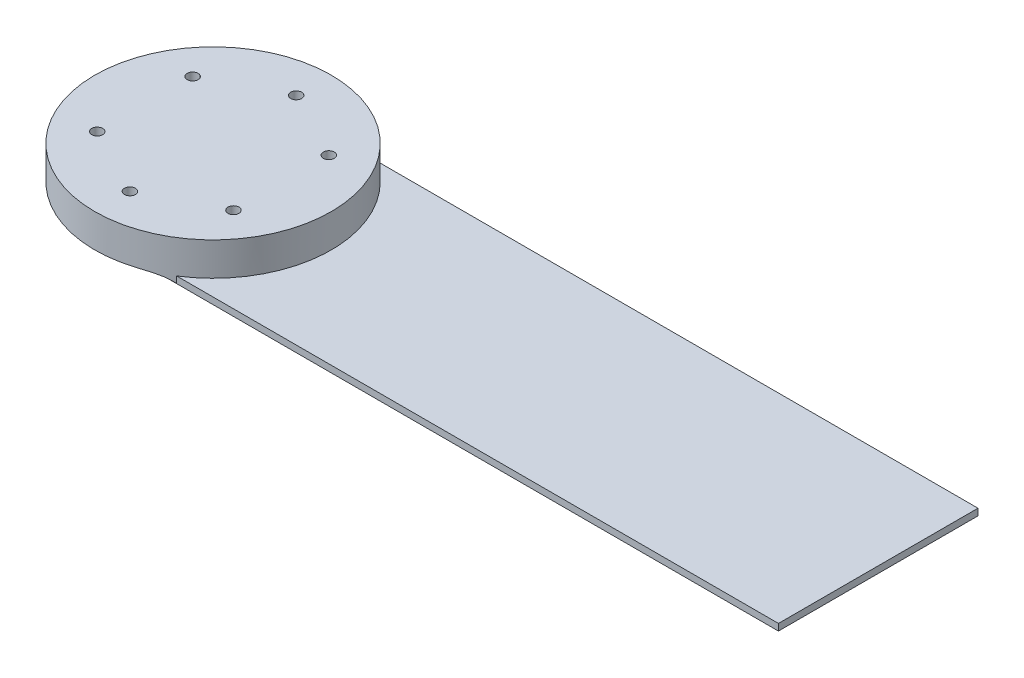
ISO-10303-21;
HEADER;
FILE_DESCRIPTION(('STEP AP214'),'2;1');
FILE_NAME('part.step','',(''),(''),'','','');
FILE_SCHEMA(('AUTOMOTIVE_DESIGN { 1 0 10303 214 1 1 1 1 }'));
ENDSEC;
DATA;
#1=APPLICATION_CONTEXT('core data for automotive mechanical design processes');
#2=APPLICATION_PROTOCOL_DEFINITION('international standard','automotive_design',2000,#1);
#3=PRODUCT_CONTEXT('',#1,'mechanical');
#4=PRODUCT('Part','Part','',(#3));
#5=PRODUCT_RELATED_PRODUCT_CATEGORY('part','',(#4));
#6=PRODUCT_DEFINITION_FORMATION('','',#4);
#7=PRODUCT_DEFINITION_CONTEXT('part definition',#1,'design');
#8=PRODUCT_DEFINITION('design','',#6,#7);
#9=PRODUCT_DEFINITION_SHAPE('','',#8);
#10=(LENGTH_UNIT() NAMED_UNIT(*) SI_UNIT(.MILLI.,.METRE.));
#11=(NAMED_UNIT(*) PLANE_ANGLE_UNIT() SI_UNIT($,.RADIAN.));
#12=(NAMED_UNIT(*) SI_UNIT($,.STERADIAN.) SOLID_ANGLE_UNIT());
#13=UNCERTAINTY_MEASURE_WITH_UNIT(LENGTH_MEASURE(1.E-05),#10,'distance_accuracy_value','');
#14=(GEOMETRIC_REPRESENTATION_CONTEXT(3) GLOBAL_UNCERTAINTY_ASSIGNED_CONTEXT((#13)) GLOBAL_UNIT_ASSIGNED_CONTEXT((#10,
#11,#12)) REPRESENTATION_CONTEXT('',''));
#15=CARTESIAN_POINT('',(0.,0.,0.));
#16=DIRECTION('',(0.,0.,1.));
#17=DIRECTION('',(1.,0.,0.));
#18=AXIS2_PLACEMENT_3D('',#15,#16,#17);
#19=CARTESIAN_POINT('',(0.,2.,60.));
#20=DIRECTION('',(0.,0.,-1.));
#21=DIRECTION('',(-1.,0.,0.));
#22=AXIS2_PLACEMENT_3D('',#19,#20,#21);
#23=PLANE('',#22);
#24=DIRECTION('',(1.,0.,0.));
#25=VECTOR('',#24,1.);
#26=CARTESIAN_POINT('',(0.,2.,60.));
#27=LINE('',#26,#25);
#28=CARTESIAN_POINT('',(19.0736074196781,2.,60.));
#29=VERTEX_POINT('',#28);
#30=CARTESIAN_POINT('',(200.,2.,60.));
#31=VERTEX_POINT('',#30);
#32=EDGE_CURVE('E122',#29,#31,#27,.T.);
#33=ORIENTED_EDGE('',*,*,#32,.F.);
#34=DIRECTION('',(0.,-1.,0.));
#35=VECTOR('',#34,1.);
#36=CARTESIAN_POINT('',(19.0736074196781,2.,60.));
#37=LINE('',#36,#35);
#38=CARTESIAN_POINT('',(19.0736074196781,0.,60.));
#39=VERTEX_POINT('',#38);
#40=EDGE_CURVE('E50',#29,#39,#37,.T.);
#41=ORIENTED_EDGE('',*,*,#40,.T.);
#42=DIRECTION('',(1.,0.,0.));
#43=VECTOR('',#42,1.);
#44=CARTESIAN_POINT('',(0.,0.,60.));
#45=LINE('',#44,#43);
#46=CARTESIAN_POINT('',(200.,0.,60.));
#47=VERTEX_POINT('',#46);
#48=EDGE_CURVE('E127',#39,#47,#45,.T.);
#49=ORIENTED_EDGE('',*,*,#48,.T.);
#50=DIRECTION('',(0.,-1.,0.));
#51=VECTOR('',#50,1.);
#52=CARTESIAN_POINT('',(200.,2.,60.));
#53=LINE('',#52,#51);
#54=EDGE_CURVE('E136',#31,#47,#53,.T.);
#55=ORIENTED_EDGE('',*,*,#54,.F.);
#56=EDGE_LOOP('',(#33,#41,#49,#55));
#57=FACE_BOUND('',#56,.T.);
#58=ADVANCED_FACE('F33',(#57),#23,.F.);
#59=CARTESIAN_POINT('',(200.,2.,60.));
#60=DIRECTION('',(-1.,0.,0.));
#61=DIRECTION('',(0.,0.,1.));
#62=AXIS2_PLACEMENT_3D('',#59,#60,#61);
#63=PLANE('',#62);
#64=DIRECTION('',(0.,0.,-1.));
#65=VECTOR('',#64,1.);
#66=CARTESIAN_POINT('',(200.,0.,60.));
#67=LINE('',#66,#65);
#68=CARTESIAN_POINT('',(200.,0.,0.));
#69=VERTEX_POINT('',#68);
#70=EDGE_CURVE('E131',#47,#69,#67,.T.);
#71=ORIENTED_EDGE('',*,*,#70,.T.);
#72=DIRECTION('',(0.,-1.,0.));
#73=VECTOR('',#72,1.);
#74=CARTESIAN_POINT('',(200.,2.,0.));
#75=LINE('',#74,#73);
#76=CARTESIAN_POINT('',(200.,2.,0.));
#77=VERTEX_POINT('',#76);
#78=EDGE_CURVE('E111',#77,#69,#75,.T.);
#79=ORIENTED_EDGE('',*,*,#78,.F.);
#80=DIRECTION('',(0.,0.,-1.));
#81=VECTOR('',#80,1.);
#82=CARTESIAN_POINT('',(200.,2.,60.));
#83=LINE('',#82,#81);
#84=EDGE_CURVE('E109',#31,#77,#83,.T.);
#85=ORIENTED_EDGE('',*,*,#84,.F.);
#86=ORIENTED_EDGE('',*,*,#54,.T.);
#87=EDGE_LOOP('',(#71,#79,#85,#86));
#88=FACE_BOUND('',#87,.T.);
#89=ADVANCED_FACE('F174',(#88),#63,.F.);
#90=CARTESIAN_POINT('',(0.,2.,0.));
#91=DIRECTION('',(0.,0.,1.));
#92=DIRECTION('',(1.,0.,0.));
#93=AXIS2_PLACEMENT_3D('',#90,#91,#92);
#94=PLANE('',#93);
#95=DIRECTION('',(-1.,0.,0.));
#96=VECTOR('',#95,1.);
#97=CARTESIAN_POINT('',(0.,0.,0.));
#98=LINE('',#97,#96);
#99=CARTESIAN_POINT('',(19.0736074196781,0.,0.));
#100=VERTEX_POINT('',#99);
#101=EDGE_CURVE('E99',#69,#100,#98,.T.);
#102=ORIENTED_EDGE('',*,*,#101,.T.);
#103=DIRECTION('',(0.,-1.,0.));
#104=VECTOR('',#103,1.);
#105=CARTESIAN_POINT('',(19.0736074196781,0.,0.));
#106=LINE('',#105,#104);
#107=CARTESIAN_POINT('',(19.0736074196781,2.,0.));
#108=VERTEX_POINT('',#107);
#109=EDGE_CURVE('E93',#100,#108,#106,.F.);
#110=ORIENTED_EDGE('',*,*,#109,.T.);
#111=DIRECTION('',(-1.,0.,0.));
#112=VECTOR('',#111,1.);
#113=CARTESIAN_POINT('',(0.,2.,0.));
#114=LINE('',#113,#112);
#115=EDGE_CURVE('E97',#77,#108,#114,.T.);
#116=ORIENTED_EDGE('',*,*,#115,.F.);
#117=ORIENTED_EDGE('',*,*,#78,.T.);
#118=EDGE_LOOP('',(#102,#110,#116,#117));
#119=FACE_BOUND('',#118,.T.);
#120=ADVANCED_FACE('F95',(#119),#94,.F.);
#121=CARTESIAN_POINT('',(0.,2.,30.));
#122=DIRECTION('',(0.,1.,0.));
#123=DIRECTION('',(0.,0.,1.));
#124=AXIS2_PLACEMENT_3D('',#121,#122,#123);
#125=PLANE('',#124);
#126=CARTESIAN_POINT('',(0.,2.,30.));
#127=DIRECTION('',(0.,1.,0.));
#128=DIRECTION('',(0.,0.,1.));
#129=AXIS2_PLACEMENT_3D('',#126,#127,#128);
#130=CIRCLE('',#129,35.55);
#131=EDGE_CURVE('E107',#29,#108,#130,.T.);
#132=ORIENTED_EDGE('',*,*,#131,.F.);
#133=ORIENTED_EDGE('',*,*,#32,.T.);
#134=ORIENTED_EDGE('',*,*,#84,.T.);
#135=ORIENTED_EDGE('',*,*,#115,.T.);
#136=EDGE_LOOP('',(#132,#133,#134,#135));
#137=FACE_BOUND('',#136,.T.);
#138=ADVANCED_FACE('F106',(#137),#125,.T.);
#139=CARTESIAN_POINT('',(0.,0.,30.));
#140=DIRECTION('',(0.,1.,0.));
#141=DIRECTION('',(0.,0.,1.));
#142=AXIS2_PLACEMENT_3D('',#139,#140,#141);
#143=PLANE('',#142);
#144=CARTESIAN_POINT('',(0.,0.,5.));
#145=DIRECTION('',(0.,1.,0.));
#146=DIRECTION('',(0.,0.,1.));
#147=AXIS2_PLACEMENT_3D('',#144,#145,#146);
#148=CIRCLE('',#147,1.65);
#149=CARTESIAN_POINT('',(0.,0.,6.65));
#150=VERTEX_POINT('',#149);
#151=EDGE_CURVE('E190',#150,#150,#148,.T.);
#152=ORIENTED_EDGE('',*,*,#151,.T.);
#153=EDGE_LOOP('',(#152));
#154=FACE_BOUND('',#153,.T.);
#155=CARTESIAN_POINT('',(20.4788011072248,0.,44.3394109087762));
#156=DIRECTION('',(0.,1.,0.));
#157=DIRECTION('',(0.,0.,1.));
#158=AXIS2_PLACEMENT_3D('',#155,#156,#157);
#159=CIRCLE('',#158,1.65);
#160=CARTESIAN_POINT('',(20.4788011072248,0.,45.9894109087762));
#161=VERTEX_POINT('',#160);
#162=EDGE_CURVE('E192',#161,#161,#159,.T.);
#163=ORIENTED_EDGE('',*,*,#162,.T.);
#164=EDGE_LOOP('',(#163));
#165=FACE_BOUND('',#164,.T.);
#166=CARTESIAN_POINT('',(0.,0.,55.));
#167=DIRECTION('',(0.,1.,0.));
#168=DIRECTION('',(0.,0.,1.));
#169=AXIS2_PLACEMENT_3D('',#166,#167,#168);
#170=CIRCLE('',#169,1.65);
#171=CARTESIAN_POINT('',(0.,0.,56.65));
#172=VERTEX_POINT('',#171);
#173=EDGE_CURVE('E196',#172,#172,#170,.T.);
#174=ORIENTED_EDGE('',*,*,#173,.T.);
#175=EDGE_LOOP('',(#174));
#176=FACE_BOUND('',#175,.T.);
#177=CARTESIAN_POINT('',(-20.4788011072248,0.,15.6605890912238));
#178=DIRECTION('',(0.,1.,0.));
#179=DIRECTION('',(0.,0.,1.));
#180=AXIS2_PLACEMENT_3D('',#177,#178,#179);
#181=CIRCLE('',#180,1.65);
#182=CARTESIAN_POINT('',(-20.4788011072248,0.,17.3105890912238));
#183=VERTEX_POINT('',#182);
#184=EDGE_CURVE('E201',#183,#183,#181,.T.);
#185=ORIENTED_EDGE('',*,*,#184,.T.);
#186=EDGE_LOOP('',(#185));
#187=FACE_BOUND('',#186,.T.);
#188=CARTESIAN_POINT('',(-20.4788011072248,0.,44.3394109087762));
#189=DIRECTION('',(0.,1.,0.));
#190=DIRECTION('',(0.,0.,1.));
#191=AXIS2_PLACEMENT_3D('',#188,#189,#190);
#192=CIRCLE('',#191,1.65);
#193=CARTESIAN_POINT('',(-20.4788011072248,0.,45.9894109087762));
#194=VERTEX_POINT('',#193);
#195=EDGE_CURVE('E204',#194,#194,#192,.T.);
#196=ORIENTED_EDGE('',*,*,#195,.T.);
#197=EDGE_LOOP('',(#196));
#198=FACE_BOUND('',#197,.T.);
#199=CARTESIAN_POINT('',(20.4788011072248,0.,15.6605890912238));
#200=DIRECTION('',(0.,1.,0.));
#201=DIRECTION('',(0.,0.,1.));
#202=AXIS2_PLACEMENT_3D('',#199,#200,#201);
#203=CIRCLE('',#202,1.65);
#204=CARTESIAN_POINT('',(20.4788011072248,0.,17.3105890912238));
#205=VERTEX_POINT('',#204);
#206=EDGE_CURVE('E207',#205,#205,#203,.T.);
#207=ORIENTED_EDGE('',*,*,#206,.T.);
#208=EDGE_LOOP('',(#207));
#209=FACE_BOUND('',#208,.T.);
#210=CARTESIAN_POINT('',(0.,0.,30.));
#211=DIRECTION('',(0.,1.,0.));
#212=DIRECTION('',(0.,0.,1.));
#213=AXIS2_PLACEMENT_3D('',#210,#211,#212);
#214=CIRCLE('',#213,30.);
#215=CARTESIAN_POINT('',(0.,0.,0.));
#216=VERTEX_POINT('',#215);
#217=CARTESIAN_POINT('',(0.,0.,60.));
#218=VERTEX_POINT('',#217);
#219=EDGE_CURVE('E118',#216,#218,#214,.T.);
#220=ORIENTED_EDGE('',*,*,#219,.F.);
#221=EDGE_CURVE('E133',#100,#216,#98,.T.);
#222=ORIENTED_EDGE('',*,*,#221,.F.);
#223=ORIENTED_EDGE('',*,*,#101,.F.);
#224=ORIENTED_EDGE('',*,*,#70,.F.);
#225=ORIENTED_EDGE('',*,*,#48,.F.);
#226=EDGE_CURVE('E128',#218,#39,#45,.T.);
#227=ORIENTED_EDGE('',*,*,#226,.F.);
#228=EDGE_LOOP('',(#220,#222,#223,#224,#225,#227));
#229=FACE_BOUND('',#228,.T.);
#230=ADVANCED_FACE('F184',(#154,#165,#176,#187,#198,#209,#229),#143,.F.);
#231=CARTESIAN_POINT('',(0.,2.,30.));
#232=DIRECTION('',(0.,1.,0.));
#233=DIRECTION('',(0.,0.,1.));
#234=AXIS2_PLACEMENT_3D('',#231,#232,#233);
#235=PLANE('',#234);
#236=CARTESIAN_POINT('',(10.3827982740685,2.,-4.));
#237=VERTEX_POINT('',#236);
#238=CARTESIAN_POINT('',(10.3827982740685,2.,64.));
#239=VERTEX_POINT('',#238);
#240=EDGE_CURVE('E115',#237,#239,#130,.T.);
#241=ORIENTED_EDGE('',*,*,#240,.F.);
#242=DIRECTION('',(-1.,0.,0.));
#243=VECTOR('',#242,1.);
#244=CARTESIAN_POINT('',(0.,2.,-4.));
#245=LINE('',#244,#243);
#246=CARTESIAN_POINT('',(0.,2.,-4.));
#247=VERTEX_POINT('',#246);
#248=EDGE_CURVE('E102',#237,#247,#245,.T.);
#249=ORIENTED_EDGE('',*,*,#248,.T.);
#250=CARTESIAN_POINT('',(0.,2.,30.));
#251=DIRECTION('',(0.,1.,0.));
#252=DIRECTION('',(0.,0.,1.));
#253=AXIS2_PLACEMENT_3D('',#250,#251,#252);
#254=CIRCLE('',#253,34.);
#255=CARTESIAN_POINT('',(0.,2.,64.));
#256=VERTEX_POINT('',#255);
#257=EDGE_CURVE('E139',#247,#256,#254,.T.);
#258=ORIENTED_EDGE('',*,*,#257,.T.);
#259=DIRECTION('',(1.,0.,0.));
#260=VECTOR('',#259,1.);
#261=CARTESIAN_POINT('',(0.,2.,64.));
#262=LINE('',#261,#260);
#263=EDGE_CURVE('E141',#256,#239,#262,.T.);
#264=ORIENTED_EDGE('',*,*,#263,.T.);
#265=EDGE_LOOP('',(#241,#249,#258,#264));
#266=FACE_BOUND('',#265,.T.);
#267=ADVANCED_FACE('F248',(#266),#235,.F.);
#268=CARTESIAN_POINT('',(0.,12.,30.));
#269=DIRECTION('',(0.,-1.,0.));
#270=DIRECTION('',(0.,0.,-1.));
#271=AXIS2_PLACEMENT_3D('',#268,#269,#270);
#272=CYLINDRICAL_SURFACE('',#271,35.55);
#273=CARTESIAN_POINT('',(0.,12.,30.));
#274=DIRECTION('',(0.,1.,0.));
#275=DIRECTION('',(0.,0.,1.));
#276=AXIS2_PLACEMENT_3D('',#273,#274,#275);
#277=CIRCLE('',#276,35.55);
#278=CARTESIAN_POINT('',(0.,12.,65.55));
#279=VERTEX_POINT('',#278);
#280=EDGE_CURVE('E114',#279,#279,#277,.T.);
#281=ORIENTED_EDGE('',*,*,#280,.F.);
#282=EDGE_LOOP('',(#281));
#283=FACE_BOUND('',#282,.T.);
#284=ORIENTED_EDGE('',*,*,#131,.T.);
#285=ORIENTED_EDGE('',*,*,#109,.F.);
#286=CARTESIAN_POINT('',(19.0736074196781,0.,0.));
#287=CARTESIAN_POINT('',(19.0002476258057,0.062181219380142,-0.0466428067696989));
#288=CARTESIAN_POINT('',(18.925394072325,0.122118796666871,-0.0938540804961025));
#289=CARTESIAN_POINT('',(18.7730400563711,0.237728041088066,-0.189129125904289));
#290=CARTESIAN_POINT('',(18.6955406949357,0.293401452187035,-0.237192539065301));
#291=CARTESIAN_POINT('',(18.4598746727655,0.454169860802624,-0.382057772357121));
#292=CARTESIAN_POINT('',(18.2981803087823,0.553312963265395,-0.479763978893166));
#293=CARTESIAN_POINT('',(17.9693036502404,0.736398048033862,-0.674791132467497));
#294=CARTESIAN_POINT('',(17.8022031594781,0.820497926201049,-0.772104127051071));
#295=CARTESIAN_POINT('',(17.4620608460536,0.976523745971139,-0.966390219528509));
#296=CARTESIAN_POINT('',(17.2890145938249,1.04844036372202,-1.0633630019772));
#297=CARTESIAN_POINT('',(16.9476788351221,1.17783860512291,-1.25083232926149));
#298=CARTESIAN_POINT('',(16.7796400932162,1.23589145057022,-1.34139494799758));
#299=CARTESIAN_POINT('',(16.4399638254372,1.34338413534334,-1.52089832469407));
#300=CARTESIAN_POINT('',(16.2683256485824,1.39282240134897,-1.60983878374193));
#301=CARTESIAN_POINT('',(15.7487273087588,1.52969032115594,-1.87366979589311));
#302=CARTESIAN_POINT('',(15.3961713564908,1.60564100116198,-2.0455215187294));
#303=CARTESIAN_POINT('',(14.6788365296932,1.73385669927019,-2.38043534380375));
#304=CARTESIAN_POINT('',(14.3139751800499,1.78589797217912,-2.54340231770083));
#305=CARTESIAN_POINT('',(13.5772172233723,1.87045860149198,-2.85760215717595));
#306=CARTESIAN_POINT('',(13.205322888993,1.90298415670616,-3.00883873539518));
#307=CARTESIAN_POINT('',(12.4261384882873,1.95476004791931,-3.3103832005408));
#308=CARTESIAN_POINT('',(12.0183738707787,1.9727580830897,-3.45967308954828));
#309=CARTESIAN_POINT('',(11.4049798116599,1.98969576552314,-3.67157640148477));
#310=CARTESIAN_POINT('',(11.2014005123017,1.99367052154063,-3.73984651762207));
#311=CARTESIAN_POINT('',(10.793004716778,1.99882056097217,-3.87269772247419));
#312=CARTESIAN_POINT('',(10.5881882161798,1.99999583435018,-3.93727879796312));
#313=CARTESIAN_POINT('',(10.3827982740685,2.,-4.));
#314=B_SPLINE_CURVE_WITH_KNOTS('',3,(#286,#287,#288,#289,#290,#291,#292,#293,#294,#295,#296,
#297,#298,#299,#300,#301,#302,#303,#304,#305,#306,#307,#308,#309,#310,#311,#312,#313),
.UNSPECIFIED.,.F.,.F.,(4,2,2,2,2,2,2,2,2,2,2,2,2,4),(0.,0.320557985535845,0.640984160910604,
1.28027773725691,1.91240729382769,2.54501845503079,3.14333158436971,3.74175387211094,
4.93891377080787,6.14705931425016,7.35482090896564,8.65803282481695,9.30226477154879,
9.94649902782261),.UNSPECIFIED.);
#315=EDGE_CURVE('E43',#100,#237,#314,.T.);
#316=ORIENTED_EDGE('',*,*,#315,.T.);
#317=ORIENTED_EDGE('',*,*,#240,.T.);
#318=CARTESIAN_POINT('',(10.3827982740685,2.,64.));
#319=CARTESIAN_POINT('',(10.6345193836277,1.99998530819901,63.9231324224037));
#320=CARTESIAN_POINT('',(10.885400105865,1.998226273855,63.8434611755539));
#321=CARTESIAN_POINT('',(11.3853229103817,1.99034455756487,63.678571497643));
#322=CARTESIAN_POINT('',(11.6343645667007,1.98422089485826,63.5933518237258));
#323=CARTESIAN_POINT('',(12.1311292925834,1.96670628147124,63.4171794558365));
#324=CARTESIAN_POINT('',(12.378845619286,1.9552985863277,63.3262093366356));
#325=CARTESIAN_POINT('',(12.8718598245443,1.92620617814595,63.1389083913143));
#326=CARTESIAN_POINT('',(13.1171578764916,1.90852191855476,63.042577952871));
#327=CARTESIAN_POINT('',(13.5964629649308,1.86650384042701,62.8481842730296));
#328=CARTESIAN_POINT('',(13.8305645313715,1.84242464140481,62.7502999228597));
#329=CARTESIAN_POINT('',(14.2958034754177,1.7862374577324,62.5499100518998));
#330=CARTESIAN_POINT('',(14.5269410450359,1.75412999595729,62.4474048324199));
#331=CARTESIAN_POINT('',(14.9855992094407,1.680614310985,62.2381419904766));
#332=CARTESIAN_POINT('',(15.213122323902,1.63921290145499,62.1313875301895));
#333=CARTESIAN_POINT('',(15.6640303875896,1.5456129769585,61.9139982554675));
#334=CARTESIAN_POINT('',(15.8874160136109,1.49341624515256,61.8033640843825));
#335=CARTESIAN_POINT('',(16.3749024979862,1.36442026269887,61.5555769571432));
#336=CARTESIAN_POINT('',(16.6378776065996,1.28476591985566,61.417668456324));
#337=CARTESIAN_POINT('',(17.1542330546879,1.10375157156529,61.1387321567154));
#338=CARTESIAN_POINT('',(17.4076261031118,1.00242159494201,60.9977089129507));
#339=CARTESIAN_POINT('',(17.7809533773142,0.829704814068673,60.7841098391811));
#340=CARTESIAN_POINT('',(17.9055194387979,0.767928855525437,60.7118078835923));
#341=CARTESIAN_POINT('',(18.1508084039262,0.636937078707178,60.5674808077034));
#342=CARTESIAN_POINT('',(18.271532436734,0.567723473006957,60.4954556116394));
#343=CARTESIAN_POINT('',(18.5090508439295,0.420798872418816,60.3518836361558));
#344=CARTESIAN_POINT('',(18.6258235197443,0.343048600526442,60.2803408251842));
#345=CARTESIAN_POINT('',(18.8540097739446,0.178493674621399,60.1387960164674));
#346=CARTESIAN_POINT('',(18.9654174508837,0.091679368331446,60.0687957594259));
#347=CARTESIAN_POINT('',(19.0736074196781,0.,60.));
#348=B_SPLINE_CURVE_WITH_KNOTS('',3,(#318,#319,#320,#321,#322,#323,#324,#325,#326,#327,#328,
#329,#330,#331,#332,#333,#334,#335,#336,#337,#338,#339,#340,#341,#342,#343,#344,#345,#346,#347),
.UNSPECIFIED.,.F.,.F.,(4,2,2,2,2,2,2,2,2,2,2,2,2,2,4),(0.,0.789588853837979,1.57935518940696,
2.37164150338192,3.16387059070413,3.92834939012185,4.69277841253799,5.45664882922184,
6.22039317118134,7.14196591810656,8.06227011787273,8.53224055229893,9.00207156345505,
9.47416281545216,9.94676202592433),.UNSPECIFIED.);
#349=EDGE_CURVE('E11',#239,#39,#348,.T.);
#350=ORIENTED_EDGE('',*,*,#349,.T.);
#351=ORIENTED_EDGE('',*,*,#40,.F.);
#352=EDGE_LOOP('',(#284,#285,#316,#317,#350,#351));
#353=FACE_BOUND('',#352,.T.);
#354=ADVANCED_FACE('F113',(#283,#353),#272,.T.);
#355=CARTESIAN_POINT('',(0.,12.,30.));
#356=DIRECTION('',(0.,1.,0.));
#357=DIRECTION('',(0.,0.,1.));
#358=AXIS2_PLACEMENT_3D('',#355,#356,#357);
#359=PLANE('',#358);
#360=CARTESIAN_POINT('',(0.,12.,5.));
#361=DIRECTION('',(0.,1.,0.));
#362=DIRECTION('',(0.,0.,1.));
#363=AXIS2_PLACEMENT_3D('',#360,#361,#362);
#364=CIRCLE('',#363,1.65);
#365=CARTESIAN_POINT('',(0.,12.,6.65));
#366=VERTEX_POINT('',#365);
#367=EDGE_CURVE('E210',#366,#366,#364,.T.);
#368=ORIENTED_EDGE('',*,*,#367,.F.);
#369=EDGE_LOOP('',(#368));
#370=FACE_BOUND('',#369,.T.);
#371=CARTESIAN_POINT('',(20.4788011072248,12.,44.3394109087762));
#372=DIRECTION('',(0.,1.,0.));
#373=DIRECTION('',(0.,0.,1.));
#374=AXIS2_PLACEMENT_3D('',#371,#372,#373);
#375=CIRCLE('',#374,1.65);
#376=CARTESIAN_POINT('',(20.4788011072248,12.,45.9894109087762));
#377=VERTEX_POINT('',#376);
#378=EDGE_CURVE('E221',#377,#377,#375,.T.);
#379=ORIENTED_EDGE('',*,*,#378,.F.);
#380=EDGE_LOOP('',(#379));
#381=FACE_BOUND('',#380,.T.);
#382=CARTESIAN_POINT('',(0.,12.,55.));
#383=DIRECTION('',(0.,1.,0.));
#384=DIRECTION('',(0.,0.,1.));
#385=AXIS2_PLACEMENT_3D('',#382,#383,#384);
#386=CIRCLE('',#385,1.65);
#387=CARTESIAN_POINT('',(0.,12.,56.65));
#388=VERTEX_POINT('',#387);
#389=EDGE_CURVE('E214',#388,#388,#386,.T.);
#390=ORIENTED_EDGE('',*,*,#389,.F.);
#391=EDGE_LOOP('',(#390));
#392=FACE_BOUND('',#391,.T.);
#393=CARTESIAN_POINT('',(-20.4788011072248,12.,15.6605890912238));
#394=DIRECTION('',(0.,1.,0.));
#395=DIRECTION('',(0.,0.,1.));
#396=AXIS2_PLACEMENT_3D('',#393,#394,#395);
#397=CIRCLE('',#396,1.65);
#398=CARTESIAN_POINT('',(-20.4788011072248,12.,17.3105890912238));
#399=VERTEX_POINT('',#398);
#400=EDGE_CURVE('E211',#399,#399,#397,.T.);
#401=ORIENTED_EDGE('',*,*,#400,.F.);
#402=EDGE_LOOP('',(#401));
#403=FACE_BOUND('',#402,.T.);
#404=CARTESIAN_POINT('',(-20.4788011072248,12.,44.3394109087762));
#405=DIRECTION('',(0.,1.,0.));
#406=DIRECTION('',(0.,0.,1.));
#407=AXIS2_PLACEMENT_3D('',#404,#405,#406);
#408=CIRCLE('',#407,1.65);
#409=CARTESIAN_POINT('',(-20.4788011072248,12.,45.9894109087762));
#410=VERTEX_POINT('',#409);
#411=EDGE_CURVE('E215',#410,#410,#408,.T.);
#412=ORIENTED_EDGE('',*,*,#411,.F.);
#413=EDGE_LOOP('',(#412));
#414=FACE_BOUND('',#413,.T.);
#415=CARTESIAN_POINT('',(20.4788011072248,12.,15.6605890912238));
#416=DIRECTION('',(0.,1.,0.));
#417=DIRECTION('',(0.,0.,1.));
#418=AXIS2_PLACEMENT_3D('',#415,#416,#417);
#419=CIRCLE('',#418,1.65);
#420=CARTESIAN_POINT('',(20.4788011072248,12.,17.3105890912238));
#421=VERTEX_POINT('',#420);
#422=EDGE_CURVE('E218',#421,#421,#419,.T.);
#423=ORIENTED_EDGE('',*,*,#422,.F.);
#424=EDGE_LOOP('',(#423));
#425=FACE_BOUND('',#424,.T.);
#426=ORIENTED_EDGE('',*,*,#280,.T.);
#427=EDGE_LOOP('',(#426));
#428=FACE_BOUND('',#427,.T.);
#429=ADVANCED_FACE('F170',(#370,#381,#392,#403,#414,#425,#428),#359,.T.);
#430=CARTESIAN_POINT('',(0.,-3.,64.));
#431=DIRECTION('',(1.,0.,0.));
#432=DIRECTION('',(0.,0.,-1.));
#433=AXIS2_PLACEMENT_3D('',#430,#431,#432);
#434=CYLINDRICAL_SURFACE('',#433,5.);
#435=ORIENTED_EDGE('',*,*,#349,.F.);
#436=ORIENTED_EDGE('',*,*,#263,.F.);
#437=CARTESIAN_POINT('',(0.,-3.,64.));
#438=DIRECTION('',(1.,0.,0.));
#439=DIRECTION('',(0.,0.,-1.));
#440=AXIS2_PLACEMENT_3D('',#437,#438,#439);
#441=CIRCLE('',#440,5.);
#442=EDGE_CURVE('E38',#218,#256,#441,.T.);
#443=ORIENTED_EDGE('',*,*,#442,.F.);
#444=ORIENTED_EDGE('',*,*,#226,.T.);
#445=EDGE_LOOP('',(#435,#436,#443,#444));
#446=FACE_BOUND('',#445,.T.);
#447=ADVANCED_FACE('F35',(#446),#434,.F.);
#448=CARTESIAN_POINT('',(0.,-3.,30.));
#449=DIRECTION('',(0.,1.,0.));
#450=DIRECTION('',(0.,0.,1.));
#451=AXIS2_PLACEMENT_3D('',#448,#449,#450);
#452=TOROIDAL_SURFACE('',#451,34.,5.);
#453=ORIENTED_EDGE('',*,*,#442,.T.);
#454=ORIENTED_EDGE('',*,*,#257,.F.);
#455=CARTESIAN_POINT('',(0.,-3.,-4.));
#456=DIRECTION('',(-1.,0.,0.));
#457=DIRECTION('',(0.,0.,1.));
#458=AXIS2_PLACEMENT_3D('',#455,#456,#457);
#459=CIRCLE('',#458,5.);
#460=EDGE_CURVE('E188',#216,#247,#459,.T.);
#461=ORIENTED_EDGE('',*,*,#460,.F.);
#462=ORIENTED_EDGE('',*,*,#219,.T.);
#463=EDGE_LOOP('',(#453,#454,#461,#462));
#464=FACE_BOUND('',#463,.T.);
#465=ADVANCED_FACE('F162',(#464),#452,.F.);
#466=CARTESIAN_POINT('',(0.,-3.,-4.));
#467=DIRECTION('',(-1.,0.,0.));
#468=DIRECTION('',(0.,0.,1.));
#469=AXIS2_PLACEMENT_3D('',#466,#467,#468);
#470=CYLINDRICAL_SURFACE('',#469,5.);
#471=ORIENTED_EDGE('',*,*,#315,.F.);
#472=ORIENTED_EDGE('',*,*,#221,.T.);
#473=ORIENTED_EDGE('',*,*,#460,.T.);
#474=ORIENTED_EDGE('',*,*,#248,.F.);
#475=EDGE_LOOP('',(#471,#472,#473,#474));
#476=FACE_BOUND('',#475,.T.);
#477=ADVANCED_FACE('F157',(#476),#470,.F.);
#478=CARTESIAN_POINT('',(20.4788011072248,-7.,15.6605890912238));
#479=DIRECTION('',(0.,1.,0.));
#480=DIRECTION('',(0.,0.,1.));
#481=AXIS2_PLACEMENT_3D('',#478,#479,#480);
#482=CYLINDRICAL_SURFACE('',#481,1.65);
#483=ORIENTED_EDGE('',*,*,#422,.T.);
#484=EDGE_LOOP('',(#483));
#485=FACE_BOUND('',#484,.T.);
#486=ORIENTED_EDGE('',*,*,#206,.F.);
#487=EDGE_LOOP('',(#486));
#488=FACE_BOUND('',#487,.T.);
#489=ADVANCED_FACE('F161',(#485,#488),#482,.F.);
#490=CARTESIAN_POINT('',(-20.4788011072248,-7.,44.3394109087762));
#491=DIRECTION('',(0.,1.,0.));
#492=DIRECTION('',(0.,0.,1.));
#493=AXIS2_PLACEMENT_3D('',#490,#491,#492);
#494=CYLINDRICAL_SURFACE('',#493,1.65);
#495=ORIENTED_EDGE('',*,*,#411,.T.);
#496=EDGE_LOOP('',(#495));
#497=FACE_BOUND('',#496,.T.);
#498=ORIENTED_EDGE('',*,*,#195,.F.);
#499=EDGE_LOOP('',(#498));
#500=FACE_BOUND('',#499,.T.);
#501=ADVANCED_FACE('F265',(#497,#500),#494,.F.);
#502=CARTESIAN_POINT('',(-20.4788011072248,-7.,15.6605890912238));
#503=DIRECTION('',(0.,1.,0.));
#504=DIRECTION('',(0.,0.,1.));
#505=AXIS2_PLACEMENT_3D('',#502,#503,#504);
#506=CYLINDRICAL_SURFACE('',#505,1.65);
#507=ORIENTED_EDGE('',*,*,#400,.T.);
#508=EDGE_LOOP('',(#507));
#509=FACE_BOUND('',#508,.T.);
#510=ORIENTED_EDGE('',*,*,#184,.F.);
#511=EDGE_LOOP('',(#510));
#512=FACE_BOUND('',#511,.T.);
#513=ADVANCED_FACE('F261',(#509,#512),#506,.F.);
#514=CARTESIAN_POINT('',(0.,-7.,55.));
#515=DIRECTION('',(0.,1.,0.));
#516=DIRECTION('',(0.,0.,1.));
#517=AXIS2_PLACEMENT_3D('',#514,#515,#516);
#518=CYLINDRICAL_SURFACE('',#517,1.65);
#519=ORIENTED_EDGE('',*,*,#389,.T.);
#520=EDGE_LOOP('',(#519));
#521=FACE_BOUND('',#520,.T.);
#522=ORIENTED_EDGE('',*,*,#173,.F.);
#523=EDGE_LOOP('',(#522));
#524=FACE_BOUND('',#523,.T.);
#525=ADVANCED_FACE('F264',(#521,#524),#518,.F.);
#526=CARTESIAN_POINT('',(20.4788011072248,-7.,44.3394109087762));
#527=DIRECTION('',(0.,1.,0.));
#528=DIRECTION('',(0.,0.,1.));
#529=AXIS2_PLACEMENT_3D('',#526,#527,#528);
#530=CYLINDRICAL_SURFACE('',#529,1.65);
#531=ORIENTED_EDGE('',*,*,#378,.T.);
#532=EDGE_LOOP('',(#531));
#533=FACE_BOUND('',#532,.T.);
#534=ORIENTED_EDGE('',*,*,#162,.F.);
#535=EDGE_LOOP('',(#534));
#536=FACE_BOUND('',#535,.T.);
#537=ADVANCED_FACE('F269',(#533,#536),#530,.F.);
#538=CARTESIAN_POINT('',(0.,-7.,5.));
#539=DIRECTION('',(0.,1.,0.));
#540=DIRECTION('',(0.,0.,1.));
#541=AXIS2_PLACEMENT_3D('',#538,#539,#540);
#542=CYLINDRICAL_SURFACE('',#541,1.65);
#543=ORIENTED_EDGE('',*,*,#367,.T.);
#544=EDGE_LOOP('',(#543));
#545=FACE_BOUND('',#544,.T.);
#546=ORIENTED_EDGE('',*,*,#151,.F.);
#547=EDGE_LOOP('',(#546));
#548=FACE_BOUND('',#547,.T.);
#549=ADVANCED_FACE('F229',(#545,#548),#542,.F.);
#550=CLOSED_SHELL('',(#58,#89,#120,#138,#230,#267,#354,#429,#447,#465,#477,#489,#501,#513,#525,
#537,#549));
#551=MANIFOLD_SOLID_BREP('B2',#550);
#552=ADVANCED_BREP_SHAPE_REPRESENTATION('',(#18,#551),#14);
#553=SHAPE_DEFINITION_REPRESENTATION(#9,#552);
ENDSEC;
END-ISO-10303-21;
